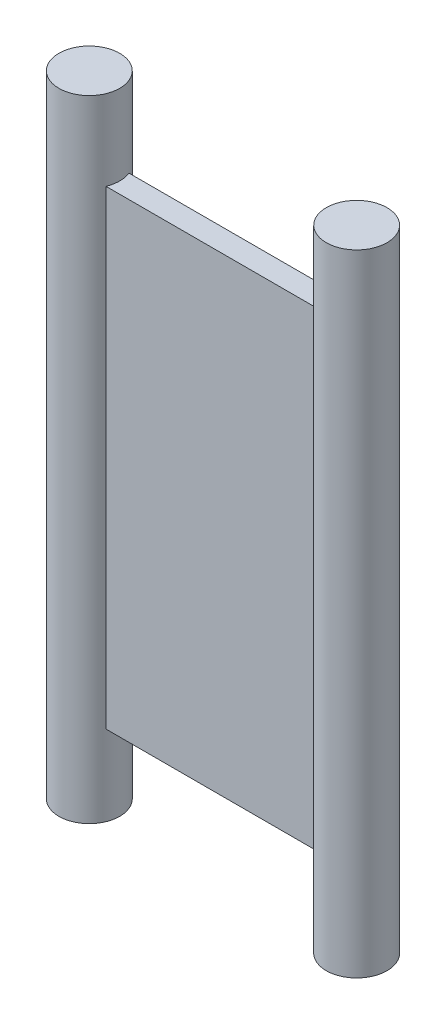
ISO-10303-21;
HEADER;
FILE_DESCRIPTION(('STEP AP214'),'2;1');
FILE_NAME('part.step','',(''),(''),'','','');
FILE_SCHEMA(('AUTOMOTIVE_DESIGN { 1 0 10303 214 1 1 1 1 }'));
ENDSEC;
DATA;
#1=APPLICATION_CONTEXT('core data for automotive mechanical design processes');
#2=APPLICATION_PROTOCOL_DEFINITION('international standard','automotive_design',2000,#1);
#3=PRODUCT_CONTEXT('',#1,'mechanical');
#4=PRODUCT('Part','Part','',(#3));
#5=PRODUCT_RELATED_PRODUCT_CATEGORY('part','',(#4));
#6=PRODUCT_DEFINITION_FORMATION('','',#4);
#7=PRODUCT_DEFINITION_CONTEXT('part definition',#1,'design');
#8=PRODUCT_DEFINITION('design','',#6,#7);
#9=PRODUCT_DEFINITION_SHAPE('','',#8);
#10=(LENGTH_UNIT() NAMED_UNIT(*) SI_UNIT(.MILLI.,.METRE.));
#11=(NAMED_UNIT(*) PLANE_ANGLE_UNIT() SI_UNIT($,.RADIAN.));
#12=(NAMED_UNIT(*) SI_UNIT($,.STERADIAN.) SOLID_ANGLE_UNIT());
#13=UNCERTAINTY_MEASURE_WITH_UNIT(LENGTH_MEASURE(1.E-05),#10,'distance_accuracy_value','');
#14=(GEOMETRIC_REPRESENTATION_CONTEXT(3) GLOBAL_UNCERTAINTY_ASSIGNED_CONTEXT((#13)) GLOBAL_UNIT_ASSIGNED_CONTEXT((#10,
#11,#12)) REPRESENTATION_CONTEXT('',''));
#15=CARTESIAN_POINT('',(0.,0.,0.));
#16=DIRECTION('',(0.,0.,1.));
#17=DIRECTION('',(1.,0.,0.));
#18=AXIS2_PLACEMENT_3D('',#15,#16,#17);
#19=CARTESIAN_POINT('',(5.83,20.5,0.499999999999999));
#20=DIRECTION('',(0.,0.,-1.));
#21=DIRECTION('',(-1.,0.,0.));
#22=AXIS2_PLACEMENT_3D('',#19,#20,#21);
#23=PLANE('',#22);
#24=DIRECTION('',(0.,-1.,0.));
#25=VECTOR('',#24,1.);
#26=CARTESIAN_POINT('',(4.6029608808192,24.,0.499999999999999));
#27=LINE('',#26,#25);
#28=CARTESIAN_POINT('',(4.6029608808192,20.5,0.499999999999999));
#29=VERTEX_POINT('',#28);
#30=CARTESIAN_POINT('',(4.6029608808192,0.,0.499999999999999));
#31=VERTEX_POINT('',#30);
#32=EDGE_CURVE('E53',#29,#31,#27,.T.);
#33=ORIENTED_EDGE('',*,*,#32,.F.);
#34=DIRECTION('',(1.,0.,0.));
#35=VECTOR('',#34,1.);
#36=CARTESIAN_POINT('',(5.83,20.5,0.499999999999999));
#37=LINE('',#36,#35);
#38=CARTESIAN_POINT('',(-4.6029608808192,20.5,0.500000000000001));
#39=VERTEX_POINT('',#38);
#40=EDGE_CURVE('E90',#39,#29,#37,.T.);
#41=ORIENTED_EDGE('',*,*,#40,.F.);
#42=DIRECTION('',(0.,-1.,0.));
#43=VECTOR('',#42,1.);
#44=CARTESIAN_POINT('',(-4.6029608808192,24.,0.500000000000001));
#45=LINE('',#44,#43);
#46=CARTESIAN_POINT('',(-4.6029608808192,0.,0.500000000000001));
#47=VERTEX_POINT('',#46);
#48=EDGE_CURVE('E103',#47,#39,#45,.F.);
#49=ORIENTED_EDGE('',*,*,#48,.F.);
#50=DIRECTION('',(1.,0.,0.));
#51=VECTOR('',#50,1.);
#52=CARTESIAN_POINT('',(5.83,0.,0.499999999999999));
#53=LINE('',#52,#51);
#54=EDGE_CURVE('E91',#47,#31,#53,.T.);
#55=ORIENTED_EDGE('',*,*,#54,.T.);
#56=EDGE_LOOP('',(#33,#41,#49,#55));
#57=FACE_BOUND('',#56,.T.);
#58=ADVANCED_FACE('F39',(#57),#23,.F.);
#59=CARTESIAN_POINT('',(5.83,20.5,-0.500000000000001));
#60=DIRECTION('',(0.,0.,1.));
#61=DIRECTION('',(1.,0.,0.));
#62=AXIS2_PLACEMENT_3D('',#59,#60,#61);
#63=PLANE('',#62);
#64=DIRECTION('',(0.,-1.,0.));
#65=VECTOR('',#64,1.);
#66=CARTESIAN_POINT('',(4.6029608808192,24.,-0.500000000000001));
#67=LINE('',#66,#65);
#68=CARTESIAN_POINT('',(4.6029608808192,0.,-0.500000000000001));
#69=VERTEX_POINT('',#68);
#70=CARTESIAN_POINT('',(4.6029608808192,20.5,-0.500000000000001));
#71=VERTEX_POINT('',#70);
#72=EDGE_CURVE('E78',#69,#71,#67,.F.);
#73=ORIENTED_EDGE('',*,*,#72,.F.);
#74=DIRECTION('',(-1.,0.,0.));
#75=VECTOR('',#74,1.);
#76=CARTESIAN_POINT('',(5.83,0.,-0.500000000000001));
#77=LINE('',#76,#75);
#78=CARTESIAN_POINT('',(-4.6029608808192,0.,-0.499999999999999));
#79=VERTEX_POINT('',#78);
#80=EDGE_CURVE('E60',#69,#79,#77,.T.);
#81=ORIENTED_EDGE('',*,*,#80,.T.);
#82=DIRECTION('',(0.,-1.,0.));
#83=VECTOR('',#82,1.);
#84=CARTESIAN_POINT('',(-4.6029608808192,24.,-0.499999999999999));
#85=LINE('',#84,#83);
#86=CARTESIAN_POINT('',(-4.6029608808192,20.5,-0.499999999999999));
#87=VERTEX_POINT('',#86);
#88=EDGE_CURVE('E105',#87,#79,#85,.T.);
#89=ORIENTED_EDGE('',*,*,#88,.F.);
#90=DIRECTION('',(-1.,0.,0.));
#91=VECTOR('',#90,1.);
#92=CARTESIAN_POINT('',(5.83,20.5,-0.500000000000001));
#93=LINE('',#92,#91);
#94=EDGE_CURVE('E85',#71,#87,#93,.T.);
#95=ORIENTED_EDGE('',*,*,#94,.F.);
#96=EDGE_LOOP('',(#73,#81,#89,#95));
#97=FACE_BOUND('',#96,.T.);
#98=ADVANCED_FACE('F84',(#97),#63,.F.);
#99=CARTESIAN_POINT('',(-5.83,24.,0.));
#100=DIRECTION('',(0.,-1.,0.));
#101=DIRECTION('',(0.,0.,-1.));
#102=AXIS2_PLACEMENT_3D('',#99,#100,#101);
#103=CYLINDRICAL_SURFACE('',#102,1.325);
#104=CARTESIAN_POINT('',(-5.83,24.,0.));
#105=DIRECTION('',(0.,1.,0.));
#106=DIRECTION('',(0.,0.,1.));
#107=AXIS2_PLACEMENT_3D('',#104,#105,#106);
#108=CIRCLE('',#107,1.325);
#109=CARTESIAN_POINT('',(-5.83,24.,1.325));
#110=VERTEX_POINT('',#109);
#111=EDGE_CURVE('E107',#110,#110,#108,.T.);
#112=ORIENTED_EDGE('',*,*,#111,.F.);
#113=EDGE_LOOP('',(#112));
#114=FACE_BOUND('',#113,.T.);
#115=CARTESIAN_POINT('',(-5.83,-3.5,0.));
#116=DIRECTION('',(0.,1.,0.));
#117=DIRECTION('',(0.,0.,1.));
#118=AXIS2_PLACEMENT_3D('',#115,#116,#117);
#119=CIRCLE('',#118,1.325);
#120=CARTESIAN_POINT('',(-5.83,-3.5,1.325));
#121=VERTEX_POINT('',#120);
#122=EDGE_CURVE('E108',#121,#121,#119,.T.);
#123=ORIENTED_EDGE('',*,*,#122,.T.);
#124=EDGE_LOOP('',(#123));
#125=FACE_BOUND('',#124,.T.);
#126=ORIENTED_EDGE('',*,*,#48,.T.);
#127=CARTESIAN_POINT('',(-5.83,20.5,0.));
#128=DIRECTION('',(0.,-1.,0.));
#129=DIRECTION('',(0.,0.,-1.));
#130=AXIS2_PLACEMENT_3D('',#127,#128,#129);
#131=CIRCLE('',#130,1.325);
#132=EDGE_CURVE('E95',#39,#87,#131,.F.);
#133=ORIENTED_EDGE('',*,*,#132,.T.);
#134=ORIENTED_EDGE('',*,*,#88,.T.);
#135=CARTESIAN_POINT('',(-5.83,0.,0.));
#136=DIRECTION('',(0.,-1.,0.));
#137=DIRECTION('',(0.,0.,-1.));
#138=AXIS2_PLACEMENT_3D('',#135,#136,#137);
#139=CIRCLE('',#138,1.325);
#140=EDGE_CURVE('E46',#47,#79,#139,.F.);
#141=ORIENTED_EDGE('',*,*,#140,.F.);
#142=EDGE_LOOP('',(#126,#133,#134,#141));
#143=FACE_BOUND('',#142,.T.);
#144=ADVANCED_FACE('F138',(#114,#125,#143),#103,.T.);
#145=CARTESIAN_POINT('',(-5.83,24.,0.));
#146=DIRECTION('',(0.,1.,0.));
#147=DIRECTION('',(0.,0.,1.));
#148=AXIS2_PLACEMENT_3D('',#145,#146,#147);
#149=PLANE('',#148);
#150=ORIENTED_EDGE('',*,*,#111,.T.);
#151=EDGE_LOOP('',(#150));
#152=FACE_BOUND('',#151,.T.);
#153=ADVANCED_FACE('F144',(#152),#149,.T.);
#154=CARTESIAN_POINT('',(-5.83,-3.5,0.));
#155=DIRECTION('',(0.,1.,0.));
#156=DIRECTION('',(0.,0.,1.));
#157=AXIS2_PLACEMENT_3D('',#154,#155,#156);
#158=PLANE('',#157);
#159=ORIENTED_EDGE('',*,*,#122,.F.);
#160=EDGE_LOOP('',(#159));
#161=FACE_BOUND('',#160,.T.);
#162=ADVANCED_FACE('F150',(#161),#158,.F.);
#163=CARTESIAN_POINT('',(0.,20.5,0.));
#164=DIRECTION('',(0.,-1.,0.));
#165=DIRECTION('',(0.,0.,-1.));
#166=AXIS2_PLACEMENT_3D('',#163,#164,#165);
#167=PLANE('',#166);
#168=CARTESIAN_POINT('',(5.83,20.5,0.));
#169=DIRECTION('',(0.,-1.,0.));
#170=DIRECTION('',(0.,0.,-1.));
#171=AXIS2_PLACEMENT_3D('',#168,#169,#170);
#172=CIRCLE('',#171,1.325);
#173=EDGE_CURVE('E111',#71,#29,#172,.F.);
#174=ORIENTED_EDGE('',*,*,#173,.F.);
#175=ORIENTED_EDGE('',*,*,#94,.T.);
#176=ORIENTED_EDGE('',*,*,#132,.F.);
#177=ORIENTED_EDGE('',*,*,#40,.T.);
#178=EDGE_LOOP('',(#174,#175,#176,#177));
#179=FACE_BOUND('',#178,.T.);
#180=ADVANCED_FACE('F141',(#179),#167,.F.);
#181=CARTESIAN_POINT('',(0.,0.,0.));
#182=DIRECTION('',(0.,-1.,0.));
#183=DIRECTION('',(0.,0.,-1.));
#184=AXIS2_PLACEMENT_3D('',#181,#182,#183);
#185=PLANE('',#184);
#186=ORIENTED_EDGE('',*,*,#80,.F.);
#187=CARTESIAN_POINT('',(5.83,0.,0.));
#188=DIRECTION('',(0.,-1.,0.));
#189=DIRECTION('',(0.,0.,-1.));
#190=AXIS2_PLACEMENT_3D('',#187,#188,#189);
#191=CIRCLE('',#190,1.325);
#192=EDGE_CURVE('E11',#69,#31,#191,.F.);
#193=ORIENTED_EDGE('',*,*,#192,.T.);
#194=ORIENTED_EDGE('',*,*,#54,.F.);
#195=ORIENTED_EDGE('',*,*,#140,.T.);
#196=EDGE_LOOP('',(#186,#193,#194,#195));
#197=FACE_BOUND('',#196,.T.);
#198=ADVANCED_FACE('F89',(#197),#185,.T.);
#199=CARTESIAN_POINT('',(5.83,24.,0.));
#200=DIRECTION('',(0.,-1.,0.));
#201=DIRECTION('',(0.,0.,-1.));
#202=AXIS2_PLACEMENT_3D('',#199,#200,#201);
#203=CYLINDRICAL_SURFACE('',#202,1.325);
#204=CARTESIAN_POINT('',(5.83,24.,0.));
#205=DIRECTION('',(0.,1.,0.));
#206=DIRECTION('',(0.,0.,1.));
#207=AXIS2_PLACEMENT_3D('',#204,#205,#206);
#208=CIRCLE('',#207,1.325);
#209=CARTESIAN_POINT('',(5.83,24.,1.325));
#210=VERTEX_POINT('',#209);
#211=EDGE_CURVE('E116',#210,#210,#208,.T.);
#212=ORIENTED_EDGE('',*,*,#211,.F.);
#213=EDGE_LOOP('',(#212));
#214=FACE_BOUND('',#213,.T.);
#215=CARTESIAN_POINT('',(5.83,-3.5,0.));
#216=DIRECTION('',(0.,1.,0.));
#217=DIRECTION('',(0.,0.,1.));
#218=AXIS2_PLACEMENT_3D('',#215,#216,#217);
#219=CIRCLE('',#218,1.325);
#220=CARTESIAN_POINT('',(5.83,-3.5,1.325));
#221=VERTEX_POINT('',#220);
#222=EDGE_CURVE('E86',#221,#221,#219,.T.);
#223=ORIENTED_EDGE('',*,*,#222,.T.);
#224=EDGE_LOOP('',(#223));
#225=FACE_BOUND('',#224,.T.);
#226=ORIENTED_EDGE('',*,*,#72,.T.);
#227=ORIENTED_EDGE('',*,*,#173,.T.);
#228=ORIENTED_EDGE('',*,*,#32,.T.);
#229=ORIENTED_EDGE('',*,*,#192,.F.);
#230=EDGE_LOOP('',(#226,#227,#228,#229));
#231=FACE_BOUND('',#230,.T.);
#232=ADVANCED_FACE('F77',(#214,#225,#231),#203,.T.);
#233=CARTESIAN_POINT('',(5.83,24.,0.));
#234=DIRECTION('',(0.,1.,0.));
#235=DIRECTION('',(0.,0.,1.));
#236=AXIS2_PLACEMENT_3D('',#233,#234,#235);
#237=PLANE('',#236);
#238=ORIENTED_EDGE('',*,*,#211,.T.);
#239=EDGE_LOOP('',(#238));
#240=FACE_BOUND('',#239,.T.);
#241=ADVANCED_FACE('F125',(#240),#237,.T.);
#242=CARTESIAN_POINT('',(5.83,-3.5,0.));
#243=DIRECTION('',(0.,1.,0.));
#244=DIRECTION('',(0.,0.,1.));
#245=AXIS2_PLACEMENT_3D('',#242,#243,#244);
#246=PLANE('',#245);
#247=ORIENTED_EDGE('',*,*,#222,.F.);
#248=EDGE_LOOP('',(#247));
#249=FACE_BOUND('',#248,.T.);
#250=ADVANCED_FACE('F123',(#249),#246,.F.);
#251=CLOSED_SHELL('',(#58,#98,#144,#153,#162,#180,#198,#232,#241,#250));
#252=MANIFOLD_SOLID_BREP('B2',#251);
#253=ADVANCED_BREP_SHAPE_REPRESENTATION('',(#18,#252),#14);
#254=SHAPE_DEFINITION_REPRESENTATION(#9,#253);
ENDSEC;
END-ISO-10303-21;
